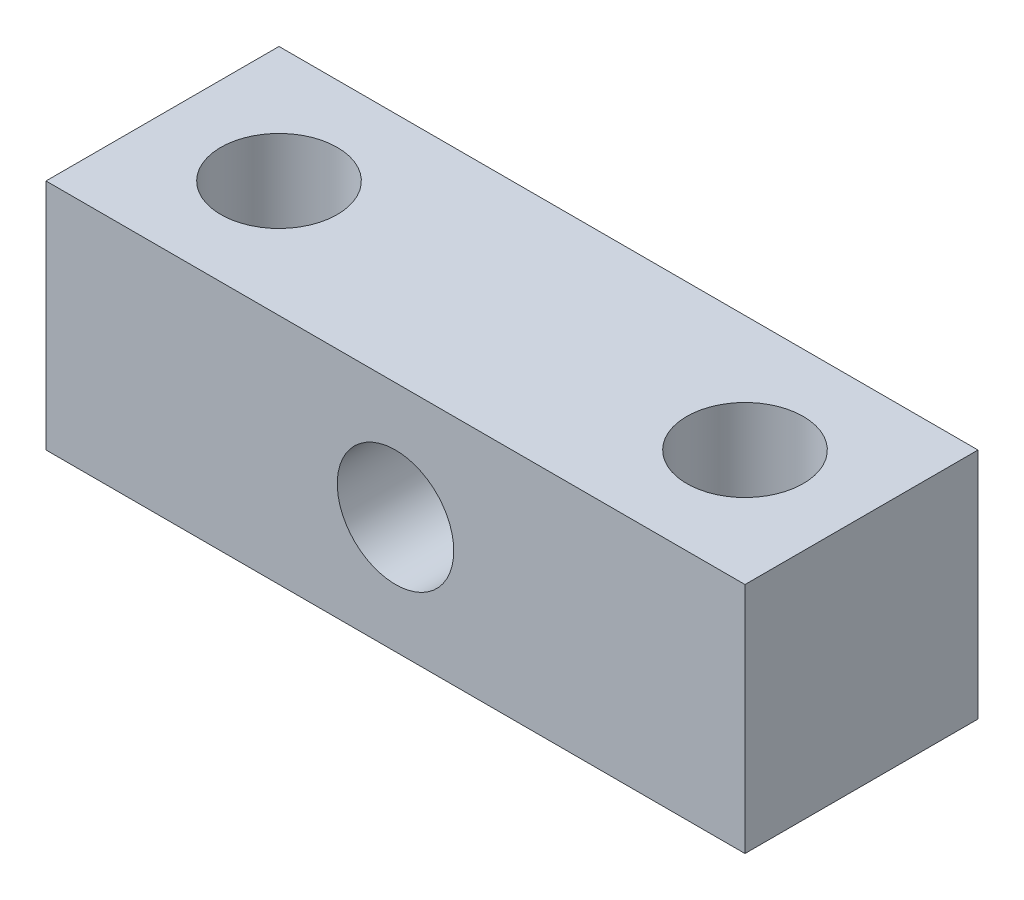
ISO-10303-21;
HEADER;
FILE_DESCRIPTION(('STEP AP214'),'2;1');
FILE_NAME('part.step','',(''),(''),'','','');
FILE_SCHEMA(('AUTOMOTIVE_DESIGN { 1 0 10303 214 1 1 1 1 }'));
ENDSEC;
DATA;
#1=APPLICATION_CONTEXT('core data for automotive mechanical design processes');
#2=APPLICATION_PROTOCOL_DEFINITION('international standard','automotive_design',2000,#1);
#3=PRODUCT_CONTEXT('',#1,'mechanical');
#4=PRODUCT('Part','Part','',(#3));
#5=PRODUCT_RELATED_PRODUCT_CATEGORY('part','',(#4));
#6=PRODUCT_DEFINITION_FORMATION('','',#4);
#7=PRODUCT_DEFINITION_CONTEXT('part definition',#1,'design');
#8=PRODUCT_DEFINITION('design','',#6,#7);
#9=PRODUCT_DEFINITION_SHAPE('','',#8);
#10=(LENGTH_UNIT() NAMED_UNIT(*) SI_UNIT(.MILLI.,.METRE.));
#11=(NAMED_UNIT(*) PLANE_ANGLE_UNIT() SI_UNIT($,.RADIAN.));
#12=(NAMED_UNIT(*) SI_UNIT($,.STERADIAN.) SOLID_ANGLE_UNIT());
#13=UNCERTAINTY_MEASURE_WITH_UNIT(LENGTH_MEASURE(1.E-05),#10,'distance_accuracy_value','');
#14=(GEOMETRIC_REPRESENTATION_CONTEXT(3) GLOBAL_UNCERTAINTY_ASSIGNED_CONTEXT((#13)) GLOBAL_UNIT_ASSIGNED_CONTEXT((#10,
#11,#12)) REPRESENTATION_CONTEXT('',''));
#15=CARTESIAN_POINT('',(0.,0.,0.));
#16=DIRECTION('',(0.,0.,1.));
#17=DIRECTION('',(1.,0.,0.));
#18=AXIS2_PLACEMENT_3D('',#15,#16,#17);
#19=CARTESIAN_POINT('',(-6.19414185427257,3.08496732026144,4.));
#20=DIRECTION('',(1.,0.,0.));
#21=DIRECTION('',(0.,1.,0.));
#22=AXIS2_PLACEMENT_3D('',#19,#20,#21);
#23=PLANE('',#22);
#24=DIRECTION('',(0.,-1.,0.));
#25=VECTOR('',#24,1.);
#26=CARTESIAN_POINT('',(-6.19414185427257,3.08496732026144,0.));
#27=LINE('',#26,#25);
#28=CARTESIAN_POINT('',(-6.19414185427257,3.08496732026144,0.));
#29=VERTEX_POINT('',#28);
#30=CARTESIAN_POINT('',(-6.19414185427257,-0.915032679738563,0.));
#31=VERTEX_POINT('',#30);
#32=EDGE_CURVE('E100',#29,#31,#27,.T.);
#33=ORIENTED_EDGE('',*,*,#32,.T.);
#34=DIRECTION('',(0.,0.,-1.));
#35=VECTOR('',#34,1.);
#36=CARTESIAN_POINT('',(-6.19414185427257,-0.915032679738563,4.));
#37=LINE('',#36,#35);
#38=CARTESIAN_POINT('',(-6.19414185427257,-0.915032679738563,4.));
#39=VERTEX_POINT('',#38);
#40=EDGE_CURVE('E11',#39,#31,#37,.T.);
#41=ORIENTED_EDGE('',*,*,#40,.F.);
#42=DIRECTION('',(0.,-1.,0.));
#43=VECTOR('',#42,1.);
#44=CARTESIAN_POINT('',(-6.19414185427257,3.08496732026144,4.));
#45=LINE('',#44,#43);
#46=CARTESIAN_POINT('',(-6.19414185427257,3.08496732026144,4.));
#47=VERTEX_POINT('',#46);
#48=EDGE_CURVE('E87',#47,#39,#45,.T.);
#49=ORIENTED_EDGE('',*,*,#48,.F.);
#50=DIRECTION('',(0.,0.,-1.));
#51=VECTOR('',#50,1.);
#52=CARTESIAN_POINT('',(-6.19414185427257,3.08496732026144,4.));
#53=LINE('',#52,#51);
#54=EDGE_CURVE('E96',#47,#29,#53,.T.);
#55=ORIENTED_EDGE('',*,*,#54,.T.);
#56=EDGE_LOOP('',(#33,#41,#49,#55));
#57=FACE_BOUND('',#56,.T.);
#58=ADVANCED_FACE('F34',(#57),#23,.F.);
#59=CARTESIAN_POINT('',(-6.19414185427257,-0.915032679738563,4.));
#60=DIRECTION('',(0.,1.,0.));
#61=DIRECTION('',(0.,0.,1.));
#62=AXIS2_PLACEMENT_3D('',#59,#60,#61);
#63=PLANE('',#62);
#64=CARTESIAN_POINT('',(3.80585814572743,-0.915032679738563,2.));
#65=DIRECTION('',(0.,-1.,0.));
#66=DIRECTION('',(0.,0.,-1.));
#67=AXIS2_PLACEMENT_3D('',#64,#65,#66);
#68=CIRCLE('',#67,1.);
#69=CARTESIAN_POINT('',(3.80585814572743,-0.915032679738563,1.));
#70=VERTEX_POINT('',#69);
#71=EDGE_CURVE('E113',#70,#70,#68,.T.);
#72=ORIENTED_EDGE('',*,*,#71,.F.);
#73=EDGE_LOOP('',(#72));
#74=FACE_BOUND('',#73,.T.);
#75=CARTESIAN_POINT('',(-4.19414185427257,-0.915032679738563,2.));
#76=DIRECTION('',(0.,-1.,0.));
#77=DIRECTION('',(0.,0.,-1.));
#78=AXIS2_PLACEMENT_3D('',#75,#76,#77);
#79=CIRCLE('',#78,1.);
#80=CARTESIAN_POINT('',(-4.19414185427257,-0.915032679738563,1.));
#81=VERTEX_POINT('',#80);
#82=EDGE_CURVE('E110',#81,#81,#79,.T.);
#83=ORIENTED_EDGE('',*,*,#82,.F.);
#84=EDGE_LOOP('',(#83));
#85=FACE_BOUND('',#84,.T.);
#86=DIRECTION('',(1.,0.,0.));
#87=VECTOR('',#86,1.);
#88=CARTESIAN_POINT('',(-6.19414185427257,-0.915032679738563,0.));
#89=LINE('',#88,#87);
#90=CARTESIAN_POINT('',(5.80585814572743,-0.915032679738563,0.));
#91=VERTEX_POINT('',#90);
#92=EDGE_CURVE('E91',#31,#91,#89,.T.);
#93=ORIENTED_EDGE('',*,*,#92,.T.);
#94=DIRECTION('',(0.,0.,-1.));
#95=VECTOR('',#94,1.);
#96=CARTESIAN_POINT('',(5.80585814572743,-0.915032679738563,4.));
#97=LINE('',#96,#95);
#98=CARTESIAN_POINT('',(5.80585814572743,-0.915032679738563,4.));
#99=VERTEX_POINT('',#98);
#100=EDGE_CURVE('E43',#99,#91,#97,.T.);
#101=ORIENTED_EDGE('',*,*,#100,.F.);
#102=DIRECTION('',(1.,0.,0.));
#103=VECTOR('',#102,1.);
#104=CARTESIAN_POINT('',(-6.19414185427257,-0.915032679738563,4.));
#105=LINE('',#104,#103);
#106=EDGE_CURVE('E82',#39,#99,#105,.T.);
#107=ORIENTED_EDGE('',*,*,#106,.F.);
#108=ORIENTED_EDGE('',*,*,#40,.T.);
#109=EDGE_LOOP('',(#93,#101,#107,#108));
#110=FACE_BOUND('',#109,.T.);
#111=ADVANCED_FACE('F90',(#74,#85,#110),#63,.F.);
#112=CARTESIAN_POINT('',(5.80585814572743,3.08496732026144,4.));
#113=DIRECTION('',(-1.,0.,0.));
#114=DIRECTION('',(0.,-1.,0.));
#115=AXIS2_PLACEMENT_3D('',#112,#113,#114);
#116=PLANE('',#115);
#117=DIRECTION('',(0.,1.,0.));
#118=VECTOR('',#117,1.);
#119=CARTESIAN_POINT('',(5.80585814572743,3.08496732026144,0.));
#120=LINE('',#119,#118);
#121=CARTESIAN_POINT('',(5.80585814572743,3.08496732026144,0.));
#122=VERTEX_POINT('',#121);
#123=EDGE_CURVE('E69',#91,#122,#120,.T.);
#124=ORIENTED_EDGE('',*,*,#123,.T.);
#125=DIRECTION('',(0.,0.,-1.));
#126=VECTOR('',#125,1.);
#127=CARTESIAN_POINT('',(5.80585814572743,3.08496732026144,4.));
#128=LINE('',#127,#126);
#129=CARTESIAN_POINT('',(5.80585814572743,3.08496732026144,4.));
#130=VERTEX_POINT('',#129);
#131=EDGE_CURVE('E92',#130,#122,#128,.T.);
#132=ORIENTED_EDGE('',*,*,#131,.F.);
#133=DIRECTION('',(0.,1.,0.));
#134=VECTOR('',#133,1.);
#135=CARTESIAN_POINT('',(5.80585814572743,3.08496732026144,4.));
#136=LINE('',#135,#134);
#137=EDGE_CURVE('E85',#99,#130,#136,.T.);
#138=ORIENTED_EDGE('',*,*,#137,.F.);
#139=ORIENTED_EDGE('',*,*,#100,.T.);
#140=EDGE_LOOP('',(#124,#132,#138,#139));
#141=FACE_BOUND('',#140,.T.);
#142=ADVANCED_FACE('F94',(#141),#116,.F.);
#143=CARTESIAN_POINT('',(-6.19414185427257,3.08496732026144,4.));
#144=DIRECTION('',(0.,-1.,0.));
#145=DIRECTION('',(0.,0.,-1.));
#146=AXIS2_PLACEMENT_3D('',#143,#144,#145);
#147=PLANE('',#146);
#148=CARTESIAN_POINT('',(3.80585814572743,3.08496732026144,2.));
#149=DIRECTION('',(0.,-1.,0.));
#150=DIRECTION('',(0.,0.,-1.));
#151=AXIS2_PLACEMENT_3D('',#148,#149,#150);
#152=CIRCLE('',#151,1.);
#153=CARTESIAN_POINT('',(3.80585814572743,3.08496732026144,1.));
#154=VERTEX_POINT('',#153);
#155=EDGE_CURVE('E111',#154,#154,#152,.T.);
#156=ORIENTED_EDGE('',*,*,#155,.T.);
#157=EDGE_LOOP('',(#156));
#158=FACE_BOUND('',#157,.T.);
#159=CARTESIAN_POINT('',(-4.19414185427257,3.08496732026144,2.));
#160=DIRECTION('',(0.,-1.,0.));
#161=DIRECTION('',(0.,0.,-1.));
#162=AXIS2_PLACEMENT_3D('',#159,#160,#161);
#163=CIRCLE('',#162,1.);
#164=CARTESIAN_POINT('',(-4.19414185427257,3.08496732026144,1.));
#165=VERTEX_POINT('',#164);
#166=EDGE_CURVE('E103',#165,#165,#163,.T.);
#167=ORIENTED_EDGE('',*,*,#166,.T.);
#168=EDGE_LOOP('',(#167));
#169=FACE_BOUND('',#168,.T.);
#170=DIRECTION('',(-1.,0.,0.));
#171=VECTOR('',#170,1.);
#172=CARTESIAN_POINT('',(-6.19414185427257,3.08496732026144,0.));
#173=LINE('',#172,#171);
#174=EDGE_CURVE('E75',#122,#29,#173,.T.);
#175=ORIENTED_EDGE('',*,*,#174,.T.);
#176=ORIENTED_EDGE('',*,*,#54,.F.);
#177=DIRECTION('',(-1.,0.,0.));
#178=VECTOR('',#177,1.);
#179=CARTESIAN_POINT('',(-6.19414185427257,3.08496732026144,4.));
#180=LINE('',#179,#178);
#181=EDGE_CURVE('E52',#130,#47,#180,.T.);
#182=ORIENTED_EDGE('',*,*,#181,.F.);
#183=ORIENTED_EDGE('',*,*,#131,.T.);
#184=EDGE_LOOP('',(#175,#176,#182,#183));
#185=FACE_BOUND('',#184,.T.);
#186=ADVANCED_FACE('F133',(#158,#169,#185),#147,.F.);
#187=CARTESIAN_POINT('',(0.,0.,4.));
#188=DIRECTION('',(0.,0.,1.));
#189=DIRECTION('',(1.,0.,0.));
#190=AXIS2_PLACEMENT_3D('',#187,#188,#189);
#191=PLANE('',#190);
#192=CARTESIAN_POINT('',(-0.194141854272571,1.08496732026144,4.));
#193=DIRECTION('',(0.,0.,1.));
#194=DIRECTION('',(1.,0.,0.));
#195=AXIS2_PLACEMENT_3D('',#192,#193,#194);
#196=CIRCLE('',#195,1.);
#197=CARTESIAN_POINT('',(0.805858145727429,1.08496732026144,4.));
#198=VERTEX_POINT('',#197);
#199=EDGE_CURVE('E123',#198,#198,#196,.T.);
#200=ORIENTED_EDGE('',*,*,#199,.F.);
#201=EDGE_LOOP('',(#200));
#202=FACE_BOUND('',#201,.T.);
#203=ORIENTED_EDGE('',*,*,#48,.T.);
#204=ORIENTED_EDGE('',*,*,#106,.T.);
#205=ORIENTED_EDGE('',*,*,#137,.T.);
#206=ORIENTED_EDGE('',*,*,#181,.T.);
#207=EDGE_LOOP('',(#203,#204,#205,#206));
#208=FACE_BOUND('',#207,.T.);
#209=ADVANCED_FACE('F83',(#202,#208),#191,.T.);
#210=CARTESIAN_POINT('',(0.,0.,0.));
#211=DIRECTION('',(0.,0.,1.));
#212=DIRECTION('',(1.,0.,0.));
#213=AXIS2_PLACEMENT_3D('',#210,#211,#212);
#214=PLANE('',#213);
#215=CARTESIAN_POINT('',(-0.194141854272571,1.08496732026144,0.));
#216=DIRECTION('',(0.,0.,1.));
#217=DIRECTION('',(1.,0.,0.));
#218=AXIS2_PLACEMENT_3D('',#215,#216,#217);
#219=CIRCLE('',#218,1.);
#220=CARTESIAN_POINT('',(0.805858145727429,1.08496732026144,0.));
#221=VERTEX_POINT('',#220);
#222=EDGE_CURVE('E37',#221,#221,#219,.T.);
#223=ORIENTED_EDGE('',*,*,#222,.T.);
#224=EDGE_LOOP('',(#223));
#225=FACE_BOUND('',#224,.T.);
#226=ORIENTED_EDGE('',*,*,#32,.F.);
#227=ORIENTED_EDGE('',*,*,#174,.F.);
#228=ORIENTED_EDGE('',*,*,#123,.F.);
#229=ORIENTED_EDGE('',*,*,#92,.F.);
#230=EDGE_LOOP('',(#226,#227,#228,#229));
#231=FACE_BOUND('',#230,.T.);
#232=ADVANCED_FACE('F132',(#225,#231),#214,.F.);
#233=CARTESIAN_POINT('',(-4.19414185427257,10.0849673202614,2.));
#234=DIRECTION('',(0.,-1.,0.));
#235=DIRECTION('',(0.,0.,-1.));
#236=AXIS2_PLACEMENT_3D('',#233,#234,#235);
#237=CYLINDRICAL_SURFACE('',#236,1.);
#238=ORIENTED_EDGE('',*,*,#82,.T.);
#239=EDGE_LOOP('',(#238));
#240=FACE_BOUND('',#239,.T.);
#241=ORIENTED_EDGE('',*,*,#166,.F.);
#242=EDGE_LOOP('',(#241));
#243=FACE_BOUND('',#242,.T.);
#244=ADVANCED_FACE('F139',(#240,#243),#237,.F.);
#245=CARTESIAN_POINT('',(3.80585814572743,10.0849673202614,2.));
#246=DIRECTION('',(0.,-1.,0.));
#247=DIRECTION('',(0.,0.,-1.));
#248=AXIS2_PLACEMENT_3D('',#245,#246,#247);
#249=CYLINDRICAL_SURFACE('',#248,1.);
#250=ORIENTED_EDGE('',*,*,#71,.T.);
#251=EDGE_LOOP('',(#250));
#252=FACE_BOUND('',#251,.T.);
#253=ORIENTED_EDGE('',*,*,#155,.F.);
#254=EDGE_LOOP('',(#253));
#255=FACE_BOUND('',#254,.T.);
#256=ADVANCED_FACE('F161',(#252,#255),#249,.F.);
#257=CARTESIAN_POINT('',(-0.194141854272571,1.08496732026144,-7.));
#258=DIRECTION('',(0.,0.,1.));
#259=DIRECTION('',(1.,0.,0.));
#260=AXIS2_PLACEMENT_3D('',#257,#258,#259);
#261=CYLINDRICAL_SURFACE('',#260,1.);
#262=ORIENTED_EDGE('',*,*,#199,.T.);
#263=EDGE_LOOP('',(#262));
#264=FACE_BOUND('',#263,.T.);
#265=ORIENTED_EDGE('',*,*,#222,.F.);
#266=EDGE_LOOP('',(#265));
#267=FACE_BOUND('',#266,.T.);
#268=ADVANCED_FACE('F128',(#264,#267),#261,.F.);
#269=CLOSED_SHELL('',(#58,#111,#142,#186,#209,#232,#244,#256,#268));
#270=MANIFOLD_SOLID_BREP('B2',#269);
#271=ADVANCED_BREP_SHAPE_REPRESENTATION('',(#18,#270),#14);
#272=SHAPE_DEFINITION_REPRESENTATION(#9,#271);
ENDSEC;
END-ISO-10303-21;
